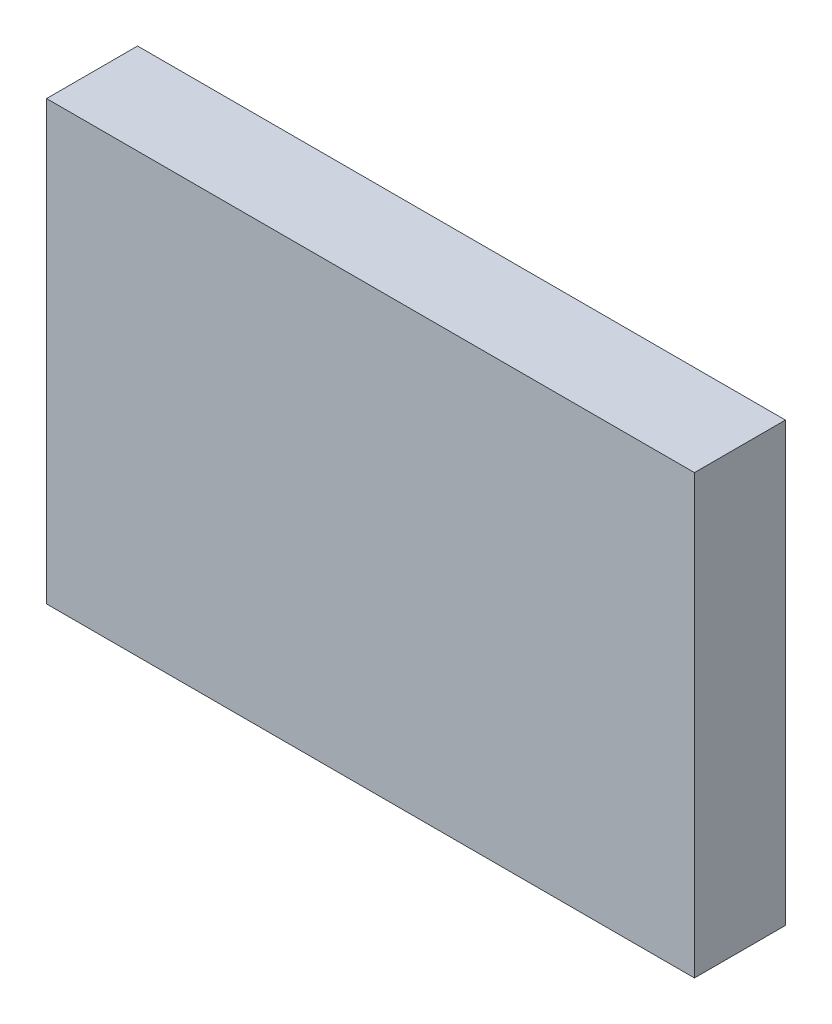
ISO-10303-21;
HEADER;
FILE_DESCRIPTION(('STEP AP214'),'2;1');
FILE_NAME('part.step','',(''),(''),'','','');
FILE_SCHEMA(('AUTOMOTIVE_DESIGN { 1 0 10303 214 1 1 1 1 }'));
ENDSEC;
DATA;
#1=APPLICATION_CONTEXT('core data for automotive mechanical design processes');
#2=APPLICATION_PROTOCOL_DEFINITION('international standard','automotive_design',2000,#1);
#3=PRODUCT_CONTEXT('',#1,'mechanical');
#4=PRODUCT('Part','Part','',(#3));
#5=PRODUCT_RELATED_PRODUCT_CATEGORY('part','',(#4));
#6=PRODUCT_DEFINITION_FORMATION('','',#4);
#7=PRODUCT_DEFINITION_CONTEXT('part definition',#1,'design');
#8=PRODUCT_DEFINITION('design','',#6,#7);
#9=PRODUCT_DEFINITION_SHAPE('','',#8);
#10=(LENGTH_UNIT() NAMED_UNIT(*) SI_UNIT(.MILLI.,.METRE.));
#11=(NAMED_UNIT(*) PLANE_ANGLE_UNIT() SI_UNIT($,.RADIAN.));
#12=(NAMED_UNIT(*) SI_UNIT($,.STERADIAN.) SOLID_ANGLE_UNIT());
#13=UNCERTAINTY_MEASURE_WITH_UNIT(LENGTH_MEASURE(1.E-05),#10,'distance_accuracy_value','');
#14=(GEOMETRIC_REPRESENTATION_CONTEXT(3) GLOBAL_UNCERTAINTY_ASSIGNED_CONTEXT((#13)) GLOBAL_UNIT_ASSIGNED_CONTEXT((#10,
#11,#12)) REPRESENTATION_CONTEXT('',''));
#15=CARTESIAN_POINT('',(0.,0.,0.));
#16=DIRECTION('',(0.,0.,1.));
#17=DIRECTION('',(1.,0.,0.));
#18=AXIS2_PLACEMENT_3D('',#15,#16,#17);
#19=CARTESIAN_POINT('',(-7.5438,-2.5654,1.1176));
#20=DIRECTION('',(0.,0.,1.));
#21=DIRECTION('',(1.,0.,0.));
#22=AXIS2_PLACEMENT_3D('',#19,#20,#21);
#23=PLANE('',#22);
#24=DIRECTION('',(0.,1.,0.));
#25=VECTOR('',#24,1.);
#26=CARTESIAN_POINT('',(0.0508,-2.5654,1.1176));
#27=LINE('',#26,#25);
#28=CARTESIAN_POINT('',(0.0508000000000001,2.5654,1.1176));
#29=VERTEX_POINT('',#28);
#30=CARTESIAN_POINT('',(0.0508000000000001,-2.5654,1.1176));
#31=VERTEX_POINT('',#30);
#32=EDGE_CURVE('E76',#29,#31,#27,.F.);
#33=ORIENTED_EDGE('',*,*,#32,.F.);
#34=DIRECTION('',(1.,0.,0.));
#35=VECTOR('',#34,1.);
#36=CARTESIAN_POINT('',(-7.5438,2.5654,1.1176));
#37=LINE('',#36,#35);
#38=CARTESIAN_POINT('',(-7.5438,2.5654,1.1176));
#39=VERTEX_POINT('',#38);
#40=EDGE_CURVE('E58',#39,#29,#37,.T.);
#41=ORIENTED_EDGE('',*,*,#40,.F.);
#42=DIRECTION('',(0.,1.,0.));
#43=VECTOR('',#42,1.);
#44=CARTESIAN_POINT('',(-7.5438,-2.5654,1.1176));
#45=LINE('',#44,#43);
#46=CARTESIAN_POINT('',(-7.5438,-2.5654,1.1176));
#47=VERTEX_POINT('',#46);
#48=EDGE_CURVE('E20',#39,#47,#45,.F.);
#49=ORIENTED_EDGE('',*,*,#48,.T.);
#50=DIRECTION('',(1.,0.,0.));
#51=VECTOR('',#50,1.);
#52=CARTESIAN_POINT('',(-7.5438,-2.5654,1.1176));
#53=LINE('',#52,#51);
#54=EDGE_CURVE('E55',#47,#31,#53,.T.);
#55=ORIENTED_EDGE('',*,*,#54,.T.);
#56=EDGE_LOOP('',(#33,#41,#49,#55));
#57=FACE_BOUND('',#56,.T.);
#58=ADVANCED_FACE('F17',(#57),#23,.T.);
#59=CARTESIAN_POINT('',(-7.5438,-2.5654,0.0508));
#60=DIRECTION('',(1.,0.,0.));
#61=DIRECTION('',(0.,0.,-1.));
#62=AXIS2_PLACEMENT_3D('',#59,#60,#61);
#63=PLANE('',#62);
#64=DIRECTION('',(0.,0.,1.));
#65=VECTOR('',#64,1.);
#66=CARTESIAN_POINT('',(-7.5438,2.5654,0.0508));
#67=LINE('',#66,#65);
#68=CARTESIAN_POINT('',(-7.5438,2.5654,0.0508));
#69=VERTEX_POINT('',#68);
#70=EDGE_CURVE('E78',#69,#39,#67,.T.);
#71=ORIENTED_EDGE('',*,*,#70,.F.);
#72=DIRECTION('',(0.,1.,0.));
#73=VECTOR('',#72,1.);
#74=CARTESIAN_POINT('',(-7.5438,-2.5654,0.0508));
#75=LINE('',#74,#73);
#76=CARTESIAN_POINT('',(-7.5438,-2.5654,0.0508));
#77=VERTEX_POINT('',#76);
#78=EDGE_CURVE('E73',#69,#77,#75,.F.);
#79=ORIENTED_EDGE('',*,*,#78,.T.);
#80=DIRECTION('',(0.,0.,1.));
#81=VECTOR('',#80,1.);
#82=CARTESIAN_POINT('',(-7.5438,-2.5654,0.0508));
#83=LINE('',#82,#81);
#84=EDGE_CURVE('E63',#77,#47,#83,.T.);
#85=ORIENTED_EDGE('',*,*,#84,.T.);
#86=ORIENTED_EDGE('',*,*,#48,.F.);
#87=EDGE_LOOP('',(#71,#79,#85,#86));
#88=FACE_BOUND('',#87,.T.);
#89=ADVANCED_FACE('F72',(#88),#63,.F.);
#90=CARTESIAN_POINT('',(-7.5438,-2.5654,0.0508));
#91=DIRECTION('',(0.,1.,0.));
#92=DIRECTION('',(0.,0.,1.));
#93=AXIS2_PLACEMENT_3D('',#90,#91,#92);
#94=PLANE('',#93);
#95=ORIENTED_EDGE('',*,*,#54,.F.);
#96=ORIENTED_EDGE('',*,*,#84,.F.);
#97=DIRECTION('',(1.,0.,0.));
#98=VECTOR('',#97,1.);
#99=CARTESIAN_POINT('',(-7.5438,-2.5654,0.0508));
#100=LINE('',#99,#98);
#101=CARTESIAN_POINT('',(0.0508000000000001,-2.5654,0.0508));
#102=VERTEX_POINT('',#101);
#103=EDGE_CURVE('E83',#77,#102,#100,.T.);
#104=ORIENTED_EDGE('',*,*,#103,.T.);
#105=DIRECTION('',(0.,0.,-1.));
#106=VECTOR('',#105,1.);
#107=CARTESIAN_POINT('',(0.0508,-2.5654,0.0508));
#108=LINE('',#107,#106);
#109=EDGE_CURVE('E69',#31,#102,#108,.T.);
#110=ORIENTED_EDGE('',*,*,#109,.F.);
#111=EDGE_LOOP('',(#95,#96,#104,#110));
#112=FACE_BOUND('',#111,.T.);
#113=ADVANCED_FACE('F66',(#112),#94,.F.);
#114=CARTESIAN_POINT('',(0.0508,-2.5654,0.0508));
#115=DIRECTION('',(1.,0.,0.));
#116=DIRECTION('',(0.,0.,-1.));
#117=AXIS2_PLACEMENT_3D('',#114,#115,#116);
#118=PLANE('',#117);
#119=DIRECTION('',(0.,0.,1.));
#120=VECTOR('',#119,1.);
#121=CARTESIAN_POINT('',(0.0508000000000002,2.5654,0.0508));
#122=LINE('',#121,#120);
#123=CARTESIAN_POINT('',(0.0508000000000001,2.5654,0.0508));
#124=VERTEX_POINT('',#123);
#125=EDGE_CURVE('E34',#29,#124,#122,.F.);
#126=ORIENTED_EDGE('',*,*,#125,.F.);
#127=ORIENTED_EDGE('',*,*,#32,.T.);
#128=ORIENTED_EDGE('',*,*,#109,.T.);
#129=DIRECTION('',(0.,1.,0.));
#130=VECTOR('',#129,1.);
#131=CARTESIAN_POINT('',(0.0508000000000002,-2.5654,0.0508));
#132=LINE('',#131,#130);
#133=EDGE_CURVE('E26',#102,#124,#132,.T.);
#134=ORIENTED_EDGE('',*,*,#133,.T.);
#135=EDGE_LOOP('',(#126,#127,#128,#134));
#136=FACE_BOUND('',#135,.T.);
#137=ADVANCED_FACE('F88',(#136),#118,.T.);
#138=CARTESIAN_POINT('',(-7.5438,2.5654,0.0508));
#139=DIRECTION('',(0.,1.,0.));
#140=DIRECTION('',(0.,0.,1.));
#141=AXIS2_PLACEMENT_3D('',#138,#139,#140);
#142=PLANE('',#141);
#143=ORIENTED_EDGE('',*,*,#40,.T.);
#144=ORIENTED_EDGE('',*,*,#125,.T.);
#145=DIRECTION('',(1.,0.,0.));
#146=VECTOR('',#145,1.);
#147=CARTESIAN_POINT('',(-7.5438,2.5654,0.0508));
#148=LINE('',#147,#146);
#149=EDGE_CURVE('E11',#124,#69,#148,.F.);
#150=ORIENTED_EDGE('',*,*,#149,.T.);
#151=ORIENTED_EDGE('',*,*,#70,.T.);
#152=EDGE_LOOP('',(#143,#144,#150,#151));
#153=FACE_BOUND('',#152,.T.);
#154=ADVANCED_FACE('F91',(#153),#142,.T.);
#155=CARTESIAN_POINT('',(-7.5438,-2.5654,0.0508));
#156=DIRECTION('',(0.,0.,1.));
#157=DIRECTION('',(1.,0.,0.));
#158=AXIS2_PLACEMENT_3D('',#155,#156,#157);
#159=PLANE('',#158);
#160=ORIENTED_EDGE('',*,*,#133,.F.);
#161=ORIENTED_EDGE('',*,*,#103,.F.);
#162=ORIENTED_EDGE('',*,*,#78,.F.);
#163=ORIENTED_EDGE('',*,*,#149,.F.);
#164=EDGE_LOOP('',(#160,#161,#162,#163));
#165=FACE_BOUND('',#164,.T.);
#166=ADVANCED_FACE('F90',(#165),#159,.F.);
#167=CLOSED_SHELL('',(#58,#89,#113,#137,#154,#166));
#168=MANIFOLD_SOLID_BREP('B1',#167);
#169=ADVANCED_BREP_SHAPE_REPRESENTATION('',(#18,#168),#14);
#170=SHAPE_DEFINITION_REPRESENTATION(#9,#169);
ENDSEC;
END-ISO-10303-21;
